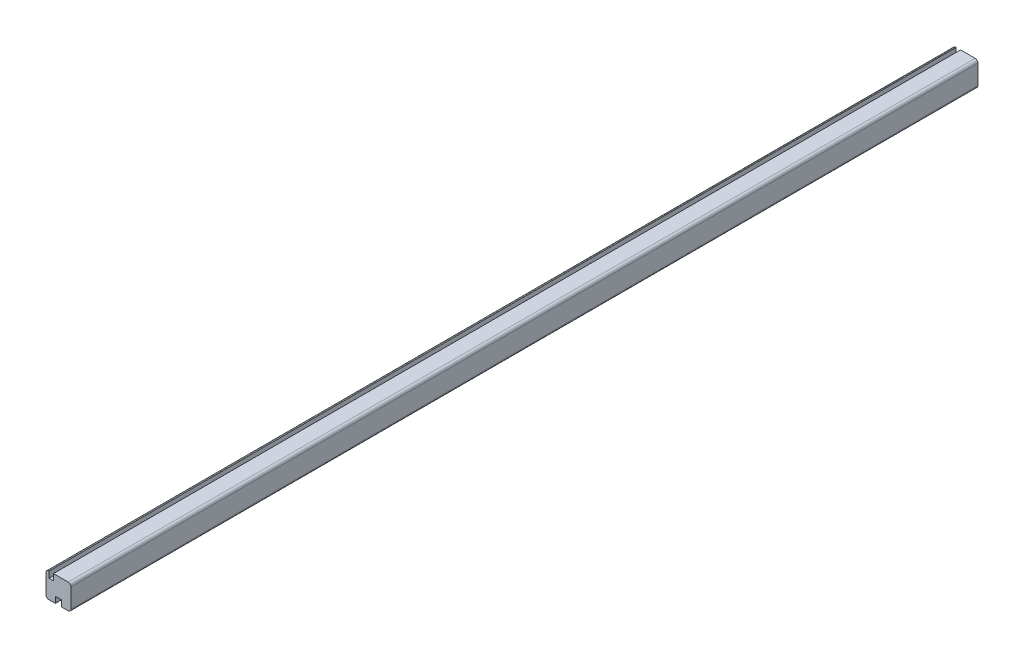
ISO-10303-21;
HEADER;
FILE_DESCRIPTION(('STEP AP214'),'2;1');
FILE_NAME('part.step','',(''),(''),'','','');
FILE_SCHEMA(('AUTOMOTIVE_DESIGN { 1 0 10303 214 1 1 1 1 }'));
ENDSEC;
DATA;
#1=APPLICATION_CONTEXT('core data for automotive mechanical design processes');
#2=APPLICATION_PROTOCOL_DEFINITION('international standard','automotive_design',2000,#1);
#3=PRODUCT_CONTEXT('',#1,'mechanical');
#4=PRODUCT('Part','Part','',(#3));
#5=PRODUCT_RELATED_PRODUCT_CATEGORY('part','',(#4));
#6=PRODUCT_DEFINITION_FORMATION('','',#4);
#7=PRODUCT_DEFINITION_CONTEXT('part definition',#1,'design');
#8=PRODUCT_DEFINITION('design','',#6,#7);
#9=PRODUCT_DEFINITION_SHAPE('','',#8);
#10=(LENGTH_UNIT() NAMED_UNIT(*) SI_UNIT(.MILLI.,.METRE.));
#11=(NAMED_UNIT(*) PLANE_ANGLE_UNIT() SI_UNIT($,.RADIAN.));
#12=(NAMED_UNIT(*) SI_UNIT($,.STERADIAN.) SOLID_ANGLE_UNIT());
#13=UNCERTAINTY_MEASURE_WITH_UNIT(LENGTH_MEASURE(1.E-05),#10,'distance_accuracy_value','');
#14=(GEOMETRIC_REPRESENTATION_CONTEXT(3) GLOBAL_UNCERTAINTY_ASSIGNED_CONTEXT((#13)) GLOBAL_UNIT_ASSIGNED_CONTEXT((#10,
#11,#12)) REPRESENTATION_CONTEXT('',''));
#15=CARTESIAN_POINT('',(0.,0.,0.));
#16=DIRECTION('',(0.,0.,1.));
#17=DIRECTION('',(1.,0.,0.));
#18=AXIS2_PLACEMENT_3D('',#15,#16,#17);
#19=CARTESIAN_POINT('',(-5.,-20.,1455.));
#20=DIRECTION('',(-1.,0.,0.));
#21=DIRECTION('',(0.,-1.,0.));
#22=AXIS2_PLACEMENT_3D('',#19,#20,#21);
#23=PLANE('',#22);
#24=DIRECTION('',(0.,1.,0.));
#25=VECTOR('',#24,1.);
#26=CARTESIAN_POINT('',(-5.,-20.,0.));
#27=LINE('',#26,#25);
#28=CARTESIAN_POINT('',(-5.,-20.,0.));
#29=VERTEX_POINT('',#28);
#30=CARTESIAN_POINT('',(-5.,-10.,0.));
#31=VERTEX_POINT('',#30);
#32=EDGE_CURVE('E176',#29,#31,#27,.T.);
#33=ORIENTED_EDGE('',*,*,#32,.T.);
#34=DIRECTION('',(0.,0.,-1.));
#35=VECTOR('',#34,1.);
#36=CARTESIAN_POINT('',(-5.,-10.,1455.));
#37=LINE('',#36,#35);
#38=CARTESIAN_POINT('',(-5.,-10.,1455.));
#39=VERTEX_POINT('',#38);
#40=EDGE_CURVE('E11',#39,#31,#37,.T.);
#41=ORIENTED_EDGE('',*,*,#40,.F.);
#42=DIRECTION('',(0.,1.,0.));
#43=VECTOR('',#42,1.);
#44=CARTESIAN_POINT('',(-5.,-20.,1455.));
#45=LINE('',#44,#43);
#46=CARTESIAN_POINT('',(-5.,-20.,1455.));
#47=VERTEX_POINT('',#46);
#48=EDGE_CURVE('E206',#47,#39,#45,.T.);
#49=ORIENTED_EDGE('',*,*,#48,.F.);
#50=DIRECTION('',(0.,0.,-1.));
#51=VECTOR('',#50,1.);
#52=CARTESIAN_POINT('',(-5.,-20.,1455.));
#53=LINE('',#52,#51);
#54=EDGE_CURVE('E172',#47,#29,#53,.T.);
#55=ORIENTED_EDGE('',*,*,#54,.T.);
#56=EDGE_LOOP('',(#33,#41,#49,#55));
#57=FACE_BOUND('',#56,.T.);
#58=ADVANCED_FACE('F32',(#57),#23,.F.);
#59=CARTESIAN_POINT('',(-5.,-10.,1455.));
#60=DIRECTION('',(0.,1.,0.));
#61=DIRECTION('',(-1.,0.,0.));
#62=AXIS2_PLACEMENT_3D('',#59,#60,#61);
#63=PLANE('',#62);
#64=DIRECTION('',(1.,0.,0.));
#65=VECTOR('',#64,1.);
#66=CARTESIAN_POINT('',(-5.,-10.,0.));
#67=LINE('',#66,#65);
#68=CARTESIAN_POINT('',(5.,-10.,0.));
#69=VERTEX_POINT('',#68);
#70=EDGE_CURVE('E179',#31,#69,#67,.T.);
#71=ORIENTED_EDGE('',*,*,#70,.T.);
#72=DIRECTION('',(0.,0.,-1.));
#73=VECTOR('',#72,1.);
#74=CARTESIAN_POINT('',(5.,-10.,1455.));
#75=LINE('',#74,#73);
#76=CARTESIAN_POINT('',(5.,-10.,1455.));
#77=VERTEX_POINT('',#76);
#78=EDGE_CURVE('E40',#77,#69,#75,.T.);
#79=ORIENTED_EDGE('',*,*,#78,.F.);
#80=DIRECTION('',(1.,0.,0.));
#81=VECTOR('',#80,1.);
#82=CARTESIAN_POINT('',(-5.,-10.,1455.));
#83=LINE('',#82,#81);
#84=EDGE_CURVE('E115',#39,#77,#83,.T.);
#85=ORIENTED_EDGE('',*,*,#84,.F.);
#86=ORIENTED_EDGE('',*,*,#40,.T.);
#87=EDGE_LOOP('',(#71,#79,#85,#86));
#88=FACE_BOUND('',#87,.T.);
#89=ADVANCED_FACE('F304',(#88),#63,.F.);
#90=CARTESIAN_POINT('',(5.,-20.,1455.));
#91=DIRECTION('',(1.,0.,0.));
#92=DIRECTION('',(0.,0.,-1.));
#93=AXIS2_PLACEMENT_3D('',#90,#91,#92);
#94=PLANE('',#93);
#95=DIRECTION('',(0.,-1.,0.));
#96=VECTOR('',#95,1.);
#97=CARTESIAN_POINT('',(5.,-20.,0.));
#98=LINE('',#97,#96);
#99=CARTESIAN_POINT('',(5.,-20.,0.));
#100=VERTEX_POINT('',#99);
#101=EDGE_CURVE('E181',#69,#100,#98,.T.);
#102=ORIENTED_EDGE('',*,*,#101,.T.);
#103=DIRECTION('',(0.,0.,-1.));
#104=VECTOR('',#103,1.);
#105=CARTESIAN_POINT('',(5.,-20.,1455.));
#106=LINE('',#105,#104);
#107=CARTESIAN_POINT('',(5.,-20.,1455.));
#108=VERTEX_POINT('',#107);
#109=EDGE_CURVE('E237',#108,#100,#106,.T.);
#110=ORIENTED_EDGE('',*,*,#109,.F.);
#111=DIRECTION('',(0.,-1.,0.));
#112=VECTOR('',#111,1.);
#113=CARTESIAN_POINT('',(5.,-20.,1455.));
#114=LINE('',#113,#112);
#115=EDGE_CURVE('E245',#77,#108,#114,.T.);
#116=ORIENTED_EDGE('',*,*,#115,.F.);
#117=ORIENTED_EDGE('',*,*,#78,.T.);
#118=EDGE_LOOP('',(#102,#110,#116,#117));
#119=FACE_BOUND('',#118,.T.);
#120=ADVANCED_FACE('F243',(#119),#94,.F.);
#121=CARTESIAN_POINT('',(5.,-20.,1455.));
#122=DIRECTION('',(0.,1.,0.));
#123=DIRECTION('',(0.,0.,1.));
#124=AXIS2_PLACEMENT_3D('',#121,#122,#123);
#125=PLANE('',#124);
#126=DIRECTION('',(1.,0.,0.));
#127=VECTOR('',#126,1.);
#128=CARTESIAN_POINT('',(5.,-20.,0.));
#129=LINE('',#128,#127);
#130=CARTESIAN_POINT('',(15.5,-20.,0.));
#131=VERTEX_POINT('',#130);
#132=EDGE_CURVE('E183',#100,#131,#129,.T.);
#133=ORIENTED_EDGE('',*,*,#132,.T.);
#134=DIRECTION('',(0.,0.,-1.));
#135=VECTOR('',#134,1.);
#136=CARTESIAN_POINT('',(15.5,-20.,1455.));
#137=LINE('',#136,#135);
#138=CARTESIAN_POINT('',(15.5,-20.,1455.));
#139=VERTEX_POINT('',#138);
#140=EDGE_CURVE('E234',#139,#131,#137,.T.);
#141=ORIENTED_EDGE('',*,*,#140,.F.);
#142=DIRECTION('',(1.,0.,0.));
#143=VECTOR('',#142,1.);
#144=CARTESIAN_POINT('',(5.,-20.,1455.));
#145=LINE('',#144,#143);
#146=EDGE_CURVE('E263',#108,#139,#145,.T.);
#147=ORIENTED_EDGE('',*,*,#146,.F.);
#148=ORIENTED_EDGE('',*,*,#109,.T.);
#149=EDGE_LOOP('',(#133,#141,#147,#148));
#150=FACE_BOUND('',#149,.T.);
#151=ADVANCED_FACE('F254',(#150),#125,.F.);
#152=CARTESIAN_POINT('',(15.5,-15.5,1455.));
#153=DIRECTION('',(0.,0.,-1.));
#154=DIRECTION('',(-1.,0.,0.));
#155=AXIS2_PLACEMENT_3D('',#152,#153,#154);
#156=CYLINDRICAL_SURFACE('',#155,4.5);
#157=CARTESIAN_POINT('',(15.5,-15.5,0.));
#158=DIRECTION('',(0.,0.,1.));
#159=DIRECTION('',(1.,0.,0.));
#160=AXIS2_PLACEMENT_3D('',#157,#158,#159);
#161=CIRCLE('',#160,4.5);
#162=CARTESIAN_POINT('',(20.,-15.5,0.));
#163=VERTEX_POINT('',#162);
#164=EDGE_CURVE('E185',#131,#163,#161,.T.);
#165=ORIENTED_EDGE('',*,*,#164,.T.);
#166=DIRECTION('',(0.,0.,-1.));
#167=VECTOR('',#166,1.);
#168=CARTESIAN_POINT('',(20.,-15.5,1455.));
#169=LINE('',#168,#167);
#170=CARTESIAN_POINT('',(20.,-15.5,1455.));
#171=VERTEX_POINT('',#170);
#172=EDGE_CURVE('E231',#171,#163,#169,.T.);
#173=ORIENTED_EDGE('',*,*,#172,.F.);
#174=CARTESIAN_POINT('',(15.5,-15.5,1455.));
#175=DIRECTION('',(0.,0.,1.));
#176=DIRECTION('',(1.,0.,0.));
#177=AXIS2_PLACEMENT_3D('',#174,#175,#176);
#178=CIRCLE('',#177,4.5);
#179=EDGE_CURVE('E260',#139,#171,#178,.T.);
#180=ORIENTED_EDGE('',*,*,#179,.F.);
#181=ORIENTED_EDGE('',*,*,#140,.T.);
#182=EDGE_LOOP('',(#165,#173,#180,#181));
#183=FACE_BOUND('',#182,.T.);
#184=ADVANCED_FACE('F258',(#183),#156,.T.);
#185=CARTESIAN_POINT('',(20.,-15.5,1455.));
#186=DIRECTION('',(-1.,0.,0.));
#187=DIRECTION('',(0.,0.,1.));
#188=AXIS2_PLACEMENT_3D('',#185,#186,#187);
#189=PLANE('',#188);
#190=DIRECTION('',(0.,1.,0.));
#191=VECTOR('',#190,1.);
#192=CARTESIAN_POINT('',(20.,-15.5,0.));
#193=LINE('',#192,#191);
#194=CARTESIAN_POINT('',(20.,15.5,0.));
#195=VERTEX_POINT('',#194);
#196=EDGE_CURVE('E187',#163,#195,#193,.T.);
#197=ORIENTED_EDGE('',*,*,#196,.T.);
#198=DIRECTION('',(0.,0.,-1.));
#199=VECTOR('',#198,1.);
#200=CARTESIAN_POINT('',(20.,15.5,1455.));
#201=LINE('',#200,#199);
#202=CARTESIAN_POINT('',(20.,15.5,1455.));
#203=VERTEX_POINT('',#202);
#204=EDGE_CURVE('E228',#203,#195,#201,.T.);
#205=ORIENTED_EDGE('',*,*,#204,.F.);
#206=DIRECTION('',(0.,1.,0.));
#207=VECTOR('',#206,1.);
#208=CARTESIAN_POINT('',(20.,-15.5,1455.));
#209=LINE('',#208,#207);
#210=EDGE_CURVE('E262',#171,#203,#209,.T.);
#211=ORIENTED_EDGE('',*,*,#210,.F.);
#212=ORIENTED_EDGE('',*,*,#172,.T.);
#213=EDGE_LOOP('',(#197,#205,#211,#212));
#214=FACE_BOUND('',#213,.T.);
#215=ADVANCED_FACE('F317',(#214),#189,.F.);
#216=CARTESIAN_POINT('',(15.5,15.5,1455.));
#217=DIRECTION('',(0.,0.,-1.));
#218=DIRECTION('',(-1.,0.,0.));
#219=AXIS2_PLACEMENT_3D('',#216,#217,#218);
#220=CYLINDRICAL_SURFACE('',#219,4.5);
#221=CARTESIAN_POINT('',(15.5,15.5,0.));
#222=DIRECTION('',(0.,0.,1.));
#223=DIRECTION('',(-1.,0.,0.));
#224=AXIS2_PLACEMENT_3D('',#221,#222,#223);
#225=CIRCLE('',#224,4.5);
#226=CARTESIAN_POINT('',(15.5,20.,0.));
#227=VERTEX_POINT('',#226);
#228=EDGE_CURVE('E189',#195,#227,#225,.T.);
#229=ORIENTED_EDGE('',*,*,#228,.T.);
#230=DIRECTION('',(0.,0.,-1.));
#231=VECTOR('',#230,1.);
#232=CARTESIAN_POINT('',(15.5,20.,1455.));
#233=LINE('',#232,#231);
#234=CARTESIAN_POINT('',(15.5,20.,1455.));
#235=VERTEX_POINT('',#234);
#236=EDGE_CURVE('E225',#235,#227,#233,.T.);
#237=ORIENTED_EDGE('',*,*,#236,.F.);
#238=CARTESIAN_POINT('',(15.5,15.5,1455.));
#239=DIRECTION('',(0.,0.,1.));
#240=DIRECTION('',(-1.,0.,0.));
#241=AXIS2_PLACEMENT_3D('',#238,#239,#240);
#242=CIRCLE('',#241,4.5);
#243=EDGE_CURVE('E265',#203,#235,#242,.T.);
#244=ORIENTED_EDGE('',*,*,#243,.F.);
#245=ORIENTED_EDGE('',*,*,#204,.T.);
#246=EDGE_LOOP('',(#229,#237,#244,#245));
#247=FACE_BOUND('',#246,.T.);
#248=ADVANCED_FACE('F320',(#247),#220,.T.);
#249=CARTESIAN_POINT('',(-8.,20.,1455.));
#250=DIRECTION('',(0.,-1.,0.));
#251=DIRECTION('',(0.,0.,-1.));
#252=AXIS2_PLACEMENT_3D('',#249,#250,#251);
#253=PLANE('',#252);
#254=DIRECTION('',(-1.,0.,0.));
#255=VECTOR('',#254,1.);
#256=CARTESIAN_POINT('',(-8.,20.,0.));
#257=LINE('',#256,#255);
#258=CARTESIAN_POINT('',(-8.,20.,0.));
#259=VERTEX_POINT('',#258);
#260=EDGE_CURVE('E191',#227,#259,#257,.T.);
#261=ORIENTED_EDGE('',*,*,#260,.T.);
#262=DIRECTION('',(0.,0.,-1.));
#263=VECTOR('',#262,1.);
#264=CARTESIAN_POINT('',(-8.,20.,1455.));
#265=LINE('',#264,#263);
#266=CARTESIAN_POINT('',(-8.,20.,1455.));
#267=VERTEX_POINT('',#266);
#268=EDGE_CURVE('E222',#267,#259,#265,.T.);
#269=ORIENTED_EDGE('',*,*,#268,.F.);
#270=DIRECTION('',(-1.,0.,0.));
#271=VECTOR('',#270,1.);
#272=CARTESIAN_POINT('',(-8.,20.,1455.));
#273=LINE('',#272,#271);
#274=EDGE_CURVE('E271',#235,#267,#273,.T.);
#275=ORIENTED_EDGE('',*,*,#274,.F.);
#276=ORIENTED_EDGE('',*,*,#236,.T.);
#277=EDGE_LOOP('',(#261,#269,#275,#276));
#278=FACE_BOUND('',#277,.T.);
#279=ADVANCED_FACE('F324',(#278),#253,.F.);
#280=CARTESIAN_POINT('',(-8.,20.,1455.));
#281=DIRECTION('',(1.,0.,0.));
#282=DIRECTION('',(0.,1.,0.));
#283=AXIS2_PLACEMENT_3D('',#280,#281,#282);
#284=PLANE('',#283);
#285=DIRECTION('',(0.,-1.,0.));
#286=VECTOR('',#285,1.);
#287=CARTESIAN_POINT('',(-8.,20.,0.));
#288=LINE('',#287,#286);
#289=CARTESIAN_POINT('',(-8.,10.,0.));
#290=VERTEX_POINT('',#289);
#291=EDGE_CURVE('E193',#259,#290,#288,.T.);
#292=ORIENTED_EDGE('',*,*,#291,.T.);
#293=DIRECTION('',(0.,0.,-1.));
#294=VECTOR('',#293,1.);
#295=CARTESIAN_POINT('',(-8.,10.,1455.));
#296=LINE('',#295,#294);
#297=CARTESIAN_POINT('',(-8.,10.,1455.));
#298=VERTEX_POINT('',#297);
#299=EDGE_CURVE('E219',#298,#290,#296,.T.);
#300=ORIENTED_EDGE('',*,*,#299,.F.);
#301=DIRECTION('',(0.,-1.,0.));
#302=VECTOR('',#301,1.);
#303=CARTESIAN_POINT('',(-8.,20.,1455.));
#304=LINE('',#303,#302);
#305=EDGE_CURVE('E273',#267,#298,#304,.T.);
#306=ORIENTED_EDGE('',*,*,#305,.F.);
#307=ORIENTED_EDGE('',*,*,#268,.T.);
#308=EDGE_LOOP('',(#292,#300,#306,#307));
#309=FACE_BOUND('',#308,.T.);
#310=ADVANCED_FACE('F328',(#309),#284,.F.);
#311=CARTESIAN_POINT('',(-15.,10.,1455.));
#312=DIRECTION('',(0.,-1.,0.));
#313=DIRECTION('',(0.,0.,-1.));
#314=AXIS2_PLACEMENT_3D('',#311,#312,#313);
#315=PLANE('',#314);
#316=DIRECTION('',(-1.,0.,0.));
#317=VECTOR('',#316,1.);
#318=CARTESIAN_POINT('',(-15.,10.,0.));
#319=LINE('',#318,#317);
#320=CARTESIAN_POINT('',(-15.,10.,0.));
#321=VERTEX_POINT('',#320);
#322=EDGE_CURVE('E195',#290,#321,#319,.T.);
#323=ORIENTED_EDGE('',*,*,#322,.T.);
#324=DIRECTION('',(0.,0.,-1.));
#325=VECTOR('',#324,1.);
#326=CARTESIAN_POINT('',(-15.,10.,1455.));
#327=LINE('',#326,#325);
#328=CARTESIAN_POINT('',(-15.,10.,1455.));
#329=VERTEX_POINT('',#328);
#330=EDGE_CURVE('E216',#329,#321,#327,.T.);
#331=ORIENTED_EDGE('',*,*,#330,.F.);
#332=DIRECTION('',(-1.,0.,0.));
#333=VECTOR('',#332,1.);
#334=CARTESIAN_POINT('',(-15.,10.,1455.));
#335=LINE('',#334,#333);
#336=EDGE_CURVE('E275',#298,#329,#335,.T.);
#337=ORIENTED_EDGE('',*,*,#336,.F.);
#338=ORIENTED_EDGE('',*,*,#299,.T.);
#339=EDGE_LOOP('',(#323,#331,#337,#338));
#340=FACE_BOUND('',#339,.T.);
#341=ADVANCED_FACE('F332',(#340),#315,.F.);
#342=CARTESIAN_POINT('',(-15.,20.,1455.));
#343=DIRECTION('',(-1.,0.,0.));
#344=DIRECTION('',(0.,-1.,0.));
#345=AXIS2_PLACEMENT_3D('',#342,#343,#344);
#346=PLANE('',#345);
#347=DIRECTION('',(0.,1.,0.));
#348=VECTOR('',#347,1.);
#349=CARTESIAN_POINT('',(-15.,20.,0.));
#350=LINE('',#349,#348);
#351=CARTESIAN_POINT('',(-15.,20.,0.));
#352=VERTEX_POINT('',#351);
#353=EDGE_CURVE('E197',#321,#352,#350,.T.);
#354=ORIENTED_EDGE('',*,*,#353,.T.);
#355=DIRECTION('',(0.,0.,-1.));
#356=VECTOR('',#355,1.);
#357=CARTESIAN_POINT('',(-15.,20.,1455.));
#358=LINE('',#357,#356);
#359=CARTESIAN_POINT('',(-15.,20.,1455.));
#360=VERTEX_POINT('',#359);
#361=EDGE_CURVE('E213',#360,#352,#358,.T.);
#362=ORIENTED_EDGE('',*,*,#361,.F.);
#363=DIRECTION('',(0.,1.,0.));
#364=VECTOR('',#363,1.);
#365=CARTESIAN_POINT('',(-15.,20.,1455.));
#366=LINE('',#365,#364);
#367=EDGE_CURVE('E277',#329,#360,#366,.T.);
#368=ORIENTED_EDGE('',*,*,#367,.F.);
#369=ORIENTED_EDGE('',*,*,#330,.T.);
#370=EDGE_LOOP('',(#354,#362,#368,#369));
#371=FACE_BOUND('',#370,.T.);
#372=ADVANCED_FACE('F336',(#371),#346,.F.);
#373=CARTESIAN_POINT('',(-15.5,20.,1455.));
#374=DIRECTION('',(0.,-1.,0.));
#375=DIRECTION('',(0.,0.,-1.));
#376=AXIS2_PLACEMENT_3D('',#373,#374,#375);
#377=PLANE('',#376);
#378=DIRECTION('',(-1.,0.,0.));
#379=VECTOR('',#378,1.);
#380=CARTESIAN_POINT('',(-15.5,20.,0.));
#381=LINE('',#380,#379);
#382=CARTESIAN_POINT('',(-15.5,20.,0.));
#383=VERTEX_POINT('',#382);
#384=EDGE_CURVE('E199',#352,#383,#381,.T.);
#385=ORIENTED_EDGE('',*,*,#384,.T.);
#386=DIRECTION('',(0.,0.,-1.));
#387=VECTOR('',#386,1.);
#388=CARTESIAN_POINT('',(-15.5,20.,1455.));
#389=LINE('',#388,#387);
#390=CARTESIAN_POINT('',(-15.5,20.,1455.));
#391=VERTEX_POINT('',#390);
#392=EDGE_CURVE('E210',#391,#383,#389,.T.);
#393=ORIENTED_EDGE('',*,*,#392,.F.);
#394=DIRECTION('',(-1.,0.,0.));
#395=VECTOR('',#394,1.);
#396=CARTESIAN_POINT('',(-15.5,20.,1455.));
#397=LINE('',#396,#395);
#398=EDGE_CURVE('E279',#360,#391,#397,.T.);
#399=ORIENTED_EDGE('',*,*,#398,.F.);
#400=ORIENTED_EDGE('',*,*,#361,.T.);
#401=EDGE_LOOP('',(#385,#393,#399,#400));
#402=FACE_BOUND('',#401,.T.);
#403=ADVANCED_FACE('F285',(#402),#377,.F.);
#404=CARTESIAN_POINT('',(-15.5,15.5,1455.));
#405=DIRECTION('',(0.,0.,-1.));
#406=DIRECTION('',(-1.,0.,0.));
#407=AXIS2_PLACEMENT_3D('',#404,#405,#406);
#408=CYLINDRICAL_SURFACE('',#407,4.5);
#409=CARTESIAN_POINT('',(-15.5,15.5,0.));
#410=DIRECTION('',(0.,0.,1.));
#411=DIRECTION('',(-1.,0.,0.));
#412=AXIS2_PLACEMENT_3D('',#409,#410,#411);
#413=CIRCLE('',#412,4.5);
#414=CARTESIAN_POINT('',(-20.,15.5,0.));
#415=VERTEX_POINT('',#414);
#416=EDGE_CURVE('E201',#383,#415,#413,.T.);
#417=ORIENTED_EDGE('',*,*,#416,.T.);
#418=DIRECTION('',(0.,0.,-1.));
#419=VECTOR('',#418,1.);
#420=CARTESIAN_POINT('',(-20.,15.5,1455.));
#421=LINE('',#420,#419);
#422=CARTESIAN_POINT('',(-20.,15.5,1455.));
#423=VERTEX_POINT('',#422);
#424=EDGE_CURVE('E167',#423,#415,#421,.T.);
#425=ORIENTED_EDGE('',*,*,#424,.F.);
#426=CARTESIAN_POINT('',(-15.5,15.5,1455.));
#427=DIRECTION('',(0.,0.,1.));
#428=DIRECTION('',(-1.,0.,0.));
#429=AXIS2_PLACEMENT_3D('',#426,#427,#428);
#430=CIRCLE('',#429,4.5);
#431=EDGE_CURVE('E158',#391,#423,#430,.T.);
#432=ORIENTED_EDGE('',*,*,#431,.F.);
#433=ORIENTED_EDGE('',*,*,#392,.T.);
#434=EDGE_LOOP('',(#417,#425,#432,#433));
#435=FACE_BOUND('',#434,.T.);
#436=ADVANCED_FACE('F289',(#435),#408,.T.);
#437=CARTESIAN_POINT('',(-20.,-15.5,1455.));
#438=DIRECTION('',(1.,0.,0.));
#439=DIRECTION('',(0.,0.,-1.));
#440=AXIS2_PLACEMENT_3D('',#437,#438,#439);
#441=PLANE('',#440);
#442=DIRECTION('',(0.,-1.,0.));
#443=VECTOR('',#442,1.);
#444=CARTESIAN_POINT('',(-20.,-15.5,0.));
#445=LINE('',#444,#443);
#446=CARTESIAN_POINT('',(-20.,-15.5,0.));
#447=VERTEX_POINT('',#446);
#448=EDGE_CURVE('E166',#415,#447,#445,.T.);
#449=ORIENTED_EDGE('',*,*,#448,.T.);
#450=DIRECTION('',(0.,0.,-1.));
#451=VECTOR('',#450,1.);
#452=CARTESIAN_POINT('',(-20.,-15.5,1455.));
#453=LINE('',#452,#451);
#454=CARTESIAN_POINT('',(-20.,-15.5,1455.));
#455=VERTEX_POINT('',#454);
#456=EDGE_CURVE('E163',#455,#447,#453,.T.);
#457=ORIENTED_EDGE('',*,*,#456,.F.);
#458=DIRECTION('',(0.,-1.,0.));
#459=VECTOR('',#458,1.);
#460=CARTESIAN_POINT('',(-20.,-15.5,1455.));
#461=LINE('',#460,#459);
#462=EDGE_CURVE('E152',#423,#455,#461,.T.);
#463=ORIENTED_EDGE('',*,*,#462,.F.);
#464=ORIENTED_EDGE('',*,*,#424,.T.);
#465=EDGE_LOOP('',(#449,#457,#463,#464));
#466=FACE_BOUND('',#465,.T.);
#467=ADVANCED_FACE('F164',(#466),#441,.F.);
#468=CARTESIAN_POINT('',(-15.5,-15.5,1455.));
#469=DIRECTION('',(0.,0.,-1.));
#470=DIRECTION('',(-1.,0.,0.));
#471=AXIS2_PLACEMENT_3D('',#468,#469,#470);
#472=CYLINDRICAL_SURFACE('',#471,4.5);
#473=CARTESIAN_POINT('',(-15.5,-15.5,0.));
#474=DIRECTION('',(0.,0.,1.));
#475=DIRECTION('',(-1.,0.,0.));
#476=AXIS2_PLACEMENT_3D('',#473,#474,#475);
#477=CIRCLE('',#476,4.5);
#478=CARTESIAN_POINT('',(-15.5,-20.,0.));
#479=VERTEX_POINT('',#478);
#480=EDGE_CURVE('E101',#447,#479,#477,.T.);
#481=ORIENTED_EDGE('',*,*,#480,.T.);
#482=DIRECTION('',(0.,0.,-1.));
#483=VECTOR('',#482,1.);
#484=CARTESIAN_POINT('',(-15.5,-20.,1455.));
#485=LINE('',#484,#483);
#486=CARTESIAN_POINT('',(-15.5,-20.,1455.));
#487=VERTEX_POINT('',#486);
#488=EDGE_CURVE('E168',#487,#479,#485,.T.);
#489=ORIENTED_EDGE('',*,*,#488,.F.);
#490=CARTESIAN_POINT('',(-15.5,-15.5,1455.));
#491=DIRECTION('',(0.,0.,1.));
#492=DIRECTION('',(-1.,0.,0.));
#493=AXIS2_PLACEMENT_3D('',#490,#491,#492);
#494=CIRCLE('',#493,4.5);
#495=EDGE_CURVE('E156',#455,#487,#494,.T.);
#496=ORIENTED_EDGE('',*,*,#495,.F.);
#497=ORIENTED_EDGE('',*,*,#456,.T.);
#498=EDGE_LOOP('',(#481,#489,#496,#497));
#499=FACE_BOUND('',#498,.T.);
#500=ADVANCED_FACE('F170',(#499),#472,.T.);
#501=CARTESIAN_POINT('',(-15.5,-20.,1455.));
#502=DIRECTION('',(0.,1.,0.));
#503=DIRECTION('',(0.,0.,1.));
#504=AXIS2_PLACEMENT_3D('',#501,#502,#503);
#505=PLANE('',#504);
#506=DIRECTION('',(1.,0.,0.));
#507=VECTOR('',#506,1.);
#508=CARTESIAN_POINT('',(-15.5,-20.,0.));
#509=LINE('',#508,#507);
#510=EDGE_CURVE('E107',#479,#29,#509,.T.);
#511=ORIENTED_EDGE('',*,*,#510,.T.);
#512=ORIENTED_EDGE('',*,*,#54,.F.);
#513=DIRECTION('',(1.,0.,0.));
#514=VECTOR('',#513,1.);
#515=CARTESIAN_POINT('',(-15.5,-20.,1455.));
#516=LINE('',#515,#514);
#517=EDGE_CURVE('E48',#487,#47,#516,.T.);
#518=ORIENTED_EDGE('',*,*,#517,.F.);
#519=ORIENTED_EDGE('',*,*,#488,.T.);
#520=EDGE_LOOP('',(#511,#512,#518,#519));
#521=FACE_BOUND('',#520,.T.);
#522=ADVANCED_FACE('F293',(#521),#505,.F.);
#523=CARTESIAN_POINT('',(15.5,-15.5,1455.));
#524=DIRECTION('',(0.,0.,1.));
#525=DIRECTION('',(1.,0.,0.));
#526=AXIS2_PLACEMENT_3D('',#523,#524,#525);
#527=PLANE('',#526);
#528=ORIENTED_EDGE('',*,*,#48,.T.);
#529=ORIENTED_EDGE('',*,*,#84,.T.);
#530=ORIENTED_EDGE('',*,*,#115,.T.);
#531=ORIENTED_EDGE('',*,*,#146,.T.);
#532=ORIENTED_EDGE('',*,*,#179,.T.);
#533=ORIENTED_EDGE('',*,*,#210,.T.);
#534=ORIENTED_EDGE('',*,*,#243,.T.);
#535=ORIENTED_EDGE('',*,*,#274,.T.);
#536=ORIENTED_EDGE('',*,*,#305,.T.);
#537=ORIENTED_EDGE('',*,*,#336,.T.);
#538=ORIENTED_EDGE('',*,*,#367,.T.);
#539=ORIENTED_EDGE('',*,*,#398,.T.);
#540=ORIENTED_EDGE('',*,*,#431,.T.);
#541=ORIENTED_EDGE('',*,*,#462,.T.);
#542=ORIENTED_EDGE('',*,*,#495,.T.);
#543=ORIENTED_EDGE('',*,*,#517,.T.);
#544=EDGE_LOOP('',(#528,#529,#530,#531,#532,#533,#534,#535,#536,#537,#538,#539,#540,#541,#542,#543));
#545=FACE_BOUND('',#544,.T.);
#546=ADVANCED_FACE('F154',(#545),#527,.T.);
#547=CARTESIAN_POINT('',(15.5,-15.5,0.));
#548=DIRECTION('',(0.,0.,1.));
#549=DIRECTION('',(1.,0.,0.));
#550=AXIS2_PLACEMENT_3D('',#547,#548,#549);
#551=PLANE('',#550);
#552=ORIENTED_EDGE('',*,*,#32,.F.);
#553=ORIENTED_EDGE('',*,*,#510,.F.);
#554=ORIENTED_EDGE('',*,*,#480,.F.);
#555=ORIENTED_EDGE('',*,*,#448,.F.);
#556=ORIENTED_EDGE('',*,*,#416,.F.);
#557=ORIENTED_EDGE('',*,*,#384,.F.);
#558=ORIENTED_EDGE('',*,*,#353,.F.);
#559=ORIENTED_EDGE('',*,*,#322,.F.);
#560=ORIENTED_EDGE('',*,*,#291,.F.);
#561=ORIENTED_EDGE('',*,*,#260,.F.);
#562=ORIENTED_EDGE('',*,*,#228,.F.);
#563=ORIENTED_EDGE('',*,*,#196,.F.);
#564=ORIENTED_EDGE('',*,*,#164,.F.);
#565=ORIENTED_EDGE('',*,*,#132,.F.);
#566=ORIENTED_EDGE('',*,*,#101,.F.);
#567=ORIENTED_EDGE('',*,*,#70,.F.);
#568=EDGE_LOOP('',(#552,#553,#554,#555,#556,#557,#558,#559,#560,#561,#562,#563,#564,#565,#566,#567));
#569=FACE_BOUND('',#568,.T.);
#570=ADVANCED_FACE('F249',(#569),#551,.F.);
#571=CLOSED_SHELL('',(#58,#89,#120,#151,#184,#215,#248,#279,#310,#341,#372,#403,#436,#467,#500,
#522,#546,#570));
#572=MANIFOLD_SOLID_BREP('B2',#571);
#573=ADVANCED_BREP_SHAPE_REPRESENTATION('',(#18,#572),#14);
#574=SHAPE_DEFINITION_REPRESENTATION(#9,#573);
ENDSEC;
END-ISO-10303-21;
